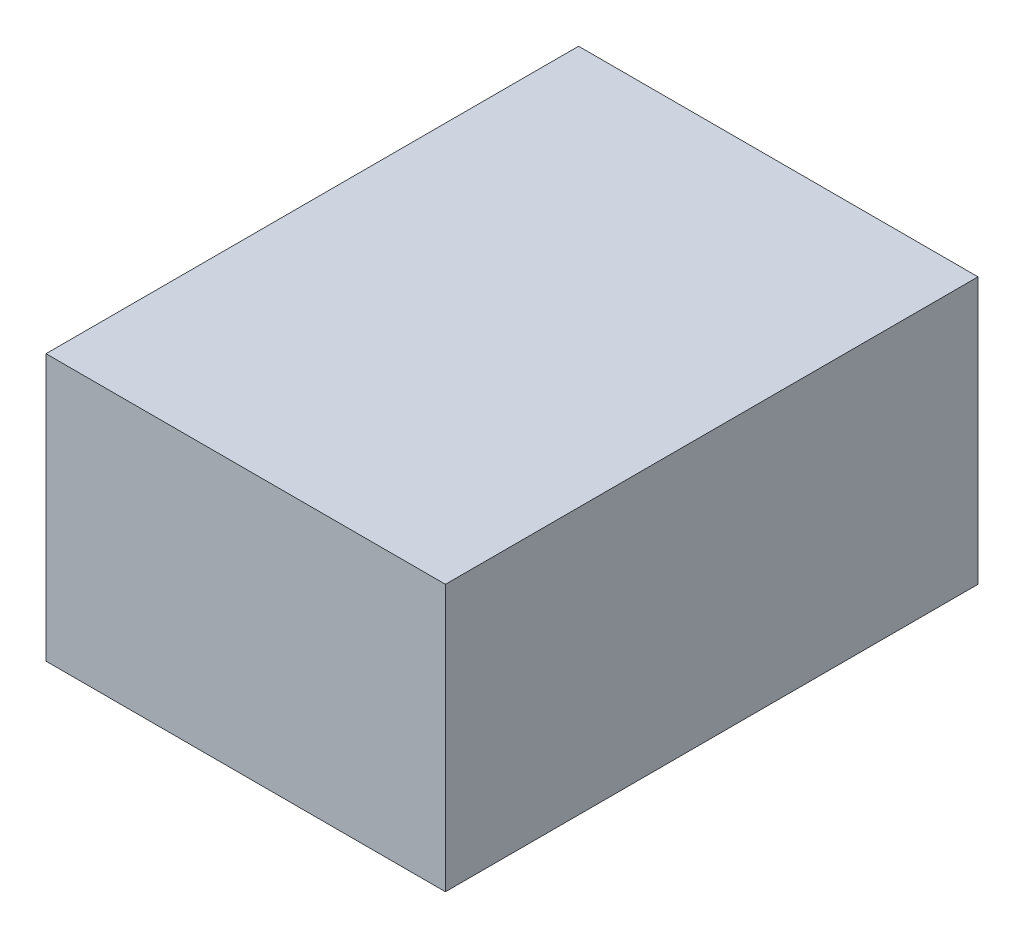
ISO-10303-21;
HEADER;
FILE_DESCRIPTION(('STEP AP214'),'2;1');
FILE_NAME('part.step','',(''),(''),'','','');
FILE_SCHEMA(('AUTOMOTIVE_DESIGN { 1 0 10303 214 1 1 1 1 }'));
ENDSEC;
DATA;
#1=APPLICATION_CONTEXT('core data for automotive mechanical design processes');
#2=APPLICATION_PROTOCOL_DEFINITION('international standard','automotive_design',2000,#1);
#3=PRODUCT_CONTEXT('',#1,'mechanical');
#4=PRODUCT('Part','Part','',(#3));
#5=PRODUCT_RELATED_PRODUCT_CATEGORY('part','',(#4));
#6=PRODUCT_DEFINITION_FORMATION('','',#4);
#7=PRODUCT_DEFINITION_CONTEXT('part definition',#1,'design');
#8=PRODUCT_DEFINITION('design','',#6,#7);
#9=PRODUCT_DEFINITION_SHAPE('','',#8);
#10=(LENGTH_UNIT() NAMED_UNIT(*) SI_UNIT(.MILLI.,.METRE.));
#11=(NAMED_UNIT(*) PLANE_ANGLE_UNIT() SI_UNIT($,.RADIAN.));
#12=(NAMED_UNIT(*) SI_UNIT($,.STERADIAN.) SOLID_ANGLE_UNIT());
#13=UNCERTAINTY_MEASURE_WITH_UNIT(LENGTH_MEASURE(1.E-05),#10,'distance_accuracy_value','');
#14=(GEOMETRIC_REPRESENTATION_CONTEXT(3) GLOBAL_UNCERTAINTY_ASSIGNED_CONTEXT((#13)) GLOBAL_UNIT_ASSIGNED_CONTEXT((#10,
#11,#12)) REPRESENTATION_CONTEXT('',''));
#15=CARTESIAN_POINT('',(0.,0.,0.));
#16=DIRECTION('',(0.,0.,1.));
#17=DIRECTION('',(1.,0.,0.));
#18=AXIS2_PLACEMENT_3D('',#15,#16,#17);
#19=CARTESIAN_POINT('',(-19.3896436082533,4.,-16.9659381572216));
#20=DIRECTION('',(1.,0.,0.));
#21=DIRECTION('',(0.,0.,-1.));
#22=AXIS2_PLACEMENT_3D('',#19,#20,#21);
#23=PLANE('',#22);
#24=DIRECTION('',(0.,0.,1.));
#25=VECTOR('',#24,1.);
#26=CARTESIAN_POINT('',(-19.3896436082533,0.,-16.9659381572216));
#27=LINE('',#26,#25);
#28=CARTESIAN_POINT('',(-19.3896436082533,0.,-16.9659381572216));
#29=VERTEX_POINT('',#28);
#30=CARTESIAN_POINT('',(-19.3896436082533,0.,-8.96593815722162));
#31=VERTEX_POINT('',#30);
#32=EDGE_CURVE('E98',#29,#31,#27,.T.);
#33=ORIENTED_EDGE('',*,*,#32,.T.);
#34=DIRECTION('',(0.,-1.,0.));
#35=VECTOR('',#34,1.);
#36=CARTESIAN_POINT('',(-19.3896436082533,4.,-8.96593815722162));
#37=LINE('',#36,#35);
#38=CARTESIAN_POINT('',(-19.3896436082533,4.,-8.96593815722162));
#39=VERTEX_POINT('',#38);
#40=EDGE_CURVE('E11',#39,#31,#37,.T.);
#41=ORIENTED_EDGE('',*,*,#40,.F.);
#42=DIRECTION('',(0.,0.,1.));
#43=VECTOR('',#42,1.);
#44=CARTESIAN_POINT('',(-19.3896436082533,4.,-16.9659381572216));
#45=LINE('',#44,#43);
#46=CARTESIAN_POINT('',(-19.3896436082533,4.,-16.9659381572216));
#47=VERTEX_POINT('',#46);
#48=EDGE_CURVE('E86',#47,#39,#45,.T.);
#49=ORIENTED_EDGE('',*,*,#48,.F.);
#50=DIRECTION('',(0.,-1.,0.));
#51=VECTOR('',#50,1.);
#52=CARTESIAN_POINT('',(-19.3896436082533,4.,-16.9659381572216));
#53=LINE('',#52,#51);
#54=EDGE_CURVE('E94',#47,#29,#53,.T.);
#55=ORIENTED_EDGE('',*,*,#54,.T.);
#56=EDGE_LOOP('',(#33,#41,#49,#55));
#57=FACE_BOUND('',#56,.T.);
#58=ADVANCED_FACE('F35',(#57),#23,.F.);
#59=CARTESIAN_POINT('',(-19.3896436082533,4.,-8.96593815722162));
#60=DIRECTION('',(0.,0.,-1.));
#61=DIRECTION('',(-1.,0.,0.));
#62=AXIS2_PLACEMENT_3D('',#59,#60,#61);
#63=PLANE('',#62);
#64=DIRECTION('',(1.,0.,0.));
#65=VECTOR('',#64,1.);
#66=CARTESIAN_POINT('',(-19.3896436082533,0.,-8.96593815722162));
#67=LINE('',#66,#65);
#68=CARTESIAN_POINT('',(-13.3896436082533,0.,-8.96593815722162));
#69=VERTEX_POINT('',#68);
#70=EDGE_CURVE('E90',#31,#69,#67,.T.);
#71=ORIENTED_EDGE('',*,*,#70,.T.);
#72=DIRECTION('',(0.,-1.,0.));
#73=VECTOR('',#72,1.);
#74=CARTESIAN_POINT('',(-13.3896436082533,4.,-8.96593815722162));
#75=LINE('',#74,#73);
#76=CARTESIAN_POINT('',(-13.3896436082533,4.,-8.96593815722162));
#77=VERTEX_POINT('',#76);
#78=EDGE_CURVE('E43',#77,#69,#75,.T.);
#79=ORIENTED_EDGE('',*,*,#78,.F.);
#80=DIRECTION('',(1.,0.,0.));
#81=VECTOR('',#80,1.);
#82=CARTESIAN_POINT('',(-19.3896436082533,4.,-8.96593815722162));
#83=LINE('',#82,#81);
#84=EDGE_CURVE('E81',#39,#77,#83,.T.);
#85=ORIENTED_EDGE('',*,*,#84,.F.);
#86=ORIENTED_EDGE('',*,*,#40,.T.);
#87=EDGE_LOOP('',(#71,#79,#85,#86));
#88=FACE_BOUND('',#87,.T.);
#89=ADVANCED_FACE('F89',(#88),#63,.F.);
#90=CARTESIAN_POINT('',(-13.3896436082533,4.,-16.9659381572216));
#91=DIRECTION('',(-1.,0.,0.));
#92=DIRECTION('',(0.,0.,1.));
#93=AXIS2_PLACEMENT_3D('',#90,#91,#92);
#94=PLANE('',#93);
#95=DIRECTION('',(0.,0.,-1.));
#96=VECTOR('',#95,1.);
#97=CARTESIAN_POINT('',(-13.3896436082533,0.,-16.9659381572216));
#98=LINE('',#97,#96);
#99=CARTESIAN_POINT('',(-13.3896436082533,0.,-16.9659381572216));
#100=VERTEX_POINT('',#99);
#101=EDGE_CURVE('E68',#69,#100,#98,.T.);
#102=ORIENTED_EDGE('',*,*,#101,.T.);
#103=DIRECTION('',(0.,-1.,0.));
#104=VECTOR('',#103,1.);
#105=CARTESIAN_POINT('',(-13.3896436082533,4.,-16.9659381572216));
#106=LINE('',#105,#104);
#107=CARTESIAN_POINT('',(-13.3896436082533,4.,-16.9659381572216));
#108=VERTEX_POINT('',#107);
#109=EDGE_CURVE('E91',#108,#100,#106,.T.);
#110=ORIENTED_EDGE('',*,*,#109,.F.);
#111=DIRECTION('',(0.,0.,-1.));
#112=VECTOR('',#111,1.);
#113=CARTESIAN_POINT('',(-13.3896436082533,4.,-16.9659381572216));
#114=LINE('',#113,#112);
#115=EDGE_CURVE('E84',#77,#108,#114,.T.);
#116=ORIENTED_EDGE('',*,*,#115,.F.);
#117=ORIENTED_EDGE('',*,*,#78,.T.);
#118=EDGE_LOOP('',(#102,#110,#116,#117));
#119=FACE_BOUND('',#118,.T.);
#120=ADVANCED_FACE('F92',(#119),#94,.F.);
#121=CARTESIAN_POINT('',(-19.3896436082533,4.,-16.9659381572216));
#122=DIRECTION('',(0.,0.,1.));
#123=DIRECTION('',(1.,0.,0.));
#124=AXIS2_PLACEMENT_3D('',#121,#122,#123);
#125=PLANE('',#124);
#126=DIRECTION('',(-1.,0.,0.));
#127=VECTOR('',#126,1.);
#128=CARTESIAN_POINT('',(-19.3896436082533,0.,-16.9659381572216));
#129=LINE('',#128,#127);
#130=EDGE_CURVE('E74',#100,#29,#129,.T.);
#131=ORIENTED_EDGE('',*,*,#130,.T.);
#132=ORIENTED_EDGE('',*,*,#54,.F.);
#133=DIRECTION('',(-1.,0.,0.));
#134=VECTOR('',#133,1.);
#135=CARTESIAN_POINT('',(-19.3896436082533,4.,-16.9659381572216));
#136=LINE('',#135,#134);
#137=EDGE_CURVE('E51',#108,#47,#136,.T.);
#138=ORIENTED_EDGE('',*,*,#137,.F.);
#139=ORIENTED_EDGE('',*,*,#109,.T.);
#140=EDGE_LOOP('',(#131,#132,#138,#139));
#141=FACE_BOUND('',#140,.T.);
#142=ADVANCED_FACE('F105',(#141),#125,.F.);
#143=CARTESIAN_POINT('',(0.,4.,0.));
#144=DIRECTION('',(0.,1.,0.));
#145=DIRECTION('',(0.,0.,1.));
#146=AXIS2_PLACEMENT_3D('',#143,#144,#145);
#147=PLANE('',#146);
#148=ORIENTED_EDGE('',*,*,#48,.T.);
#149=ORIENTED_EDGE('',*,*,#84,.T.);
#150=ORIENTED_EDGE('',*,*,#115,.T.);
#151=ORIENTED_EDGE('',*,*,#137,.T.);
#152=EDGE_LOOP('',(#148,#149,#150,#151));
#153=FACE_BOUND('',#152,.T.);
#154=ADVANCED_FACE('F82',(#153),#147,.T.);
#155=CARTESIAN_POINT('',(0.,0.,0.));
#156=DIRECTION('',(0.,1.,0.));
#157=DIRECTION('',(0.,0.,1.));
#158=AXIS2_PLACEMENT_3D('',#155,#156,#157);
#159=PLANE('',#158);
#160=ORIENTED_EDGE('',*,*,#32,.F.);
#161=ORIENTED_EDGE('',*,*,#130,.F.);
#162=ORIENTED_EDGE('',*,*,#101,.F.);
#163=ORIENTED_EDGE('',*,*,#70,.F.);
#164=EDGE_LOOP('',(#160,#161,#162,#163));
#165=FACE_BOUND('',#164,.T.);
#166=ADVANCED_FACE('F108',(#165),#159,.F.);
#167=CLOSED_SHELL('',(#58,#89,#120,#142,#154,#166));
#168=MANIFOLD_SOLID_BREP('B2',#167);
#169=ADVANCED_BREP_SHAPE_REPRESENTATION('',(#18,#168),#14);
#170=SHAPE_DEFINITION_REPRESENTATION(#9,#169);
ENDSEC;
END-ISO-10303-21;
